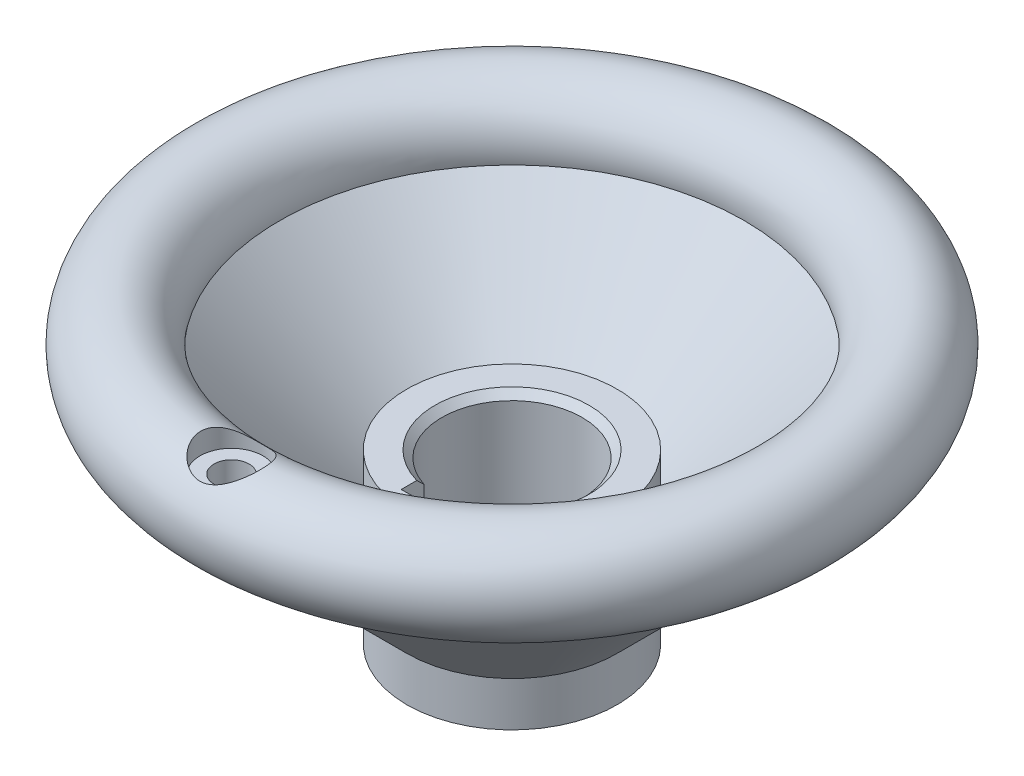
ISO-10303-21;
HEADER;
FILE_DESCRIPTION(('STEP AP214'),'2;1');
FILE_NAME('part.step','',(''),(''),'','','');
FILE_SCHEMA(('AUTOMOTIVE_DESIGN { 1 0 10303 214 1 1 1 1 }'));
ENDSEC;
DATA;
#1=APPLICATION_CONTEXT('core data for automotive mechanical design processes');
#2=APPLICATION_PROTOCOL_DEFINITION('international standard','automotive_design',2000,#1);
#3=PRODUCT_CONTEXT('',#1,'mechanical');
#4=PRODUCT('Part','Part','',(#3));
#5=PRODUCT_RELATED_PRODUCT_CATEGORY('part','',(#4));
#6=PRODUCT_DEFINITION_FORMATION('','',#4);
#7=PRODUCT_DEFINITION_CONTEXT('part definition',#1,'design');
#8=PRODUCT_DEFINITION('design','',#6,#7);
#9=PRODUCT_DEFINITION_SHAPE('','',#8);
#10=(LENGTH_UNIT() NAMED_UNIT(*) SI_UNIT(.MILLI.,.METRE.));
#11=(NAMED_UNIT(*) PLANE_ANGLE_UNIT() SI_UNIT($,.RADIAN.));
#12=(NAMED_UNIT(*) SI_UNIT($,.STERADIAN.) SOLID_ANGLE_UNIT());
#13=UNCERTAINTY_MEASURE_WITH_UNIT(LENGTH_MEASURE(1.E-05),#10,'distance_accuracy_value','');
#14=(GEOMETRIC_REPRESENTATION_CONTEXT(3) GLOBAL_UNCERTAINTY_ASSIGNED_CONTEXT((#13)) GLOBAL_UNIT_ASSIGNED_CONTEXT((#10,
#11,#12)) REPRESENTATION_CONTEXT('',''));
#15=CARTESIAN_POINT('',(0.,0.,0.));
#16=DIRECTION('',(0.,0.,1.));
#17=DIRECTION('',(1.,0.,0.));
#18=AXIS2_PLACEMENT_3D('',#15,#16,#17);
#19=CARTESIAN_POINT('',(0.,12.,0.));
#20=DIRECTION('',(0.,-1.,0.));
#21=DIRECTION('',(0.,0.,-1.));
#22=AXIS2_PLACEMENT_3D('',#19,#20,#21);
#23=CYLINDRICAL_SURFACE('',#22,7.5);
#24=CARTESIAN_POINT('',(0.,8.82842712474618,0.));
#25=DIRECTION('',(0.,1.,0.));
#26=DIRECTION('',(0.,0.,1.));
#27=AXIS2_PLACEMENT_3D('',#24,#25,#26);
#28=CIRCLE('',#27,7.5);
#29=CARTESIAN_POINT('',(0.,8.82842712474618,7.5));
#30=VERTEX_POINT('',#29);
#31=EDGE_CURVE('E165',#30,#30,#28,.T.);
#32=ORIENTED_EDGE('',*,*,#31,.T.);
#33=EDGE_LOOP('',(#32));
#34=FACE_BOUND('',#33,.T.);
#35=CARTESIAN_POINT('',(0.,12.,0.));
#36=DIRECTION('',(0.,1.,0.));
#37=DIRECTION('',(0.,0.,1.));
#38=AXIS2_PLACEMENT_3D('',#35,#36,#37);
#39=CIRCLE('',#38,7.5);
#40=CARTESIAN_POINT('',(0.,12.,7.5));
#41=VERTEX_POINT('',#40);
#42=EDGE_CURVE('E158',#41,#41,#39,.T.);
#43=ORIENTED_EDGE('',*,*,#42,.F.);
#44=EDGE_LOOP('',(#43));
#45=FACE_BOUND('',#44,.T.);
#46=ADVANCED_FACE('F45',(#34,#45),#23,.T.);
#47=CARTESIAN_POINT('',(0.,12.,0.));
#48=DIRECTION('',(0.,1.,0.));
#49=DIRECTION('',(0.,0.,1.));
#50=AXIS2_PLACEMENT_3D('',#47,#48,#49);
#51=PLANE('',#50);
#52=DIRECTION('',(0.,0.,1.));
#53=VECTOR('',#52,1.);
#54=CARTESIAN_POINT('',(-1.5,12.,4.76969600708473));
#55=LINE('',#54,#53);
#56=CARTESIAN_POINT('',(-1.5,12.,5.29150262212919));
#57=VERTEX_POINT('',#56);
#58=CARTESIAN_POINT('',(-1.5,12.,6.4));
#59=VERTEX_POINT('',#58);
#60=EDGE_CURVE('E138',#57,#59,#55,.T.);
#61=ORIENTED_EDGE('',*,*,#60,.F.);
#62=CARTESIAN_POINT('',(0.,12.,0.));
#63=DIRECTION('',(0.,1.,0.));
#64=DIRECTION('',(0.,0.,1.));
#65=AXIS2_PLACEMENT_3D('',#62,#63,#64);
#66=CIRCLE('',#65,5.50000000000001);
#67=CARTESIAN_POINT('',(1.5,12.,5.29150262212919));
#68=VERTEX_POINT('',#67);
#69=EDGE_CURVE('E60',#57,#68,#66,.F.);
#70=ORIENTED_EDGE('',*,*,#69,.T.);
#71=DIRECTION('',(0.,0.,-1.));
#72=VECTOR('',#71,1.);
#73=CARTESIAN_POINT('',(1.5,12.,4.76969600708473));
#74=LINE('',#73,#72);
#75=CARTESIAN_POINT('',(1.5,12.,6.4));
#76=VERTEX_POINT('',#75);
#77=EDGE_CURVE('E122',#76,#68,#74,.T.);
#78=ORIENTED_EDGE('',*,*,#77,.F.);
#79=DIRECTION('',(1.,0.,0.));
#80=VECTOR('',#79,1.);
#81=CARTESIAN_POINT('',(-1.5,12.,6.4));
#82=LINE('',#81,#80);
#83=EDGE_CURVE('E131',#59,#76,#82,.T.);
#84=ORIENTED_EDGE('',*,*,#83,.F.);
#85=EDGE_LOOP('',(#61,#70,#78,#84));
#86=FACE_BOUND('',#85,.T.);
#87=ORIENTED_EDGE('',*,*,#42,.T.);
#88=EDGE_LOOP('',(#87));
#89=FACE_BOUND('',#88,.T.);
#90=ADVANCED_FACE('F234',(#86,#89),#51,.T.);
#91=CARTESIAN_POINT('',(0.,17.8832039612141,0.));
#92=DIRECTION('',(0.,1.,0.));
#93=DIRECTION('',(0.,0.,1.));
#94=AXIS2_PLACEMENT_3D('',#91,#92,#93);
#95=CONICAL_SURFACE('',#94,16.5547768364679,0.78539816339745);
#96=CARTESIAN_POINT('',(0.,17.8832039612141,0.));
#97=DIRECTION('',(0.,-1.,0.));
#98=DIRECTION('',(0.,0.,-1.));
#99=AXIS2_PLACEMENT_3D('',#96,#97,#98);
#100=CIRCLE('',#99,16.5547768364679);
#101=CARTESIAN_POINT('',(0.,17.8832039612141,-16.5547768364679));
#102=VERTEX_POINT('',#101);
#103=EDGE_CURVE('E144',#102,#102,#100,.T.);
#104=ORIENTED_EDGE('',*,*,#103,.F.);
#105=EDGE_LOOP('',(#104));
#106=FACE_BOUND('',#105,.T.);
#107=ORIENTED_EDGE('',*,*,#31,.F.);
#108=EDGE_LOOP('',(#107));
#109=FACE_BOUND('',#108,.T.);
#110=ADVANCED_FACE('F237',(#106,#109),#95,.F.);
#111=CARTESIAN_POINT('',(0.,1.48222981154403,0.));
#112=DIRECTION('',(0.,1.,0.));
#113=DIRECTION('',(0.,0.,1.));
#114=AXIS2_PLACEMENT_3D('',#111,#112,#113);
#115=CONICAL_SURFACE('',#114,5.8106569362902,0.78539816339745);
#116=CARTESIAN_POINT('',(0.,15.0547768364679,0.));
#117=DIRECTION('',(0.,-1.,0.));
#118=DIRECTION('',(0.,0.,-1.));
#119=AXIS2_PLACEMENT_3D('',#116,#117,#118);
#120=CIRCLE('',#119,19.3832039612141);
#121=CARTESIAN_POINT('',(0.,15.0547768364679,-19.3832039612141));
#122=VERTEX_POINT('',#121);
#123=EDGE_CURVE('E154',#122,#122,#120,.T.);
#124=ORIENTED_EDGE('',*,*,#123,.T.);
#125=EDGE_LOOP('',(#124));
#126=FACE_BOUND('',#125,.T.);
#127=CARTESIAN_POINT('',(0.,3.17157287525382,0.));
#128=DIRECTION('',(0.,1.,0.));
#129=DIRECTION('',(0.,0.,1.));
#130=AXIS2_PLACEMENT_3D('',#127,#128,#129);
#131=CIRCLE('',#130,7.5);
#132=CARTESIAN_POINT('',(0.,3.17157287525382,7.5));
#133=VERTEX_POINT('',#132);
#134=EDGE_CURVE('E157',#133,#133,#131,.F.);
#135=ORIENTED_EDGE('',*,*,#134,.F.);
#136=EDGE_LOOP('',(#135));
#137=FACE_BOUND('',#136,.T.);
#138=ADVANCED_FACE('F239',(#126,#137),#115,.T.);
#139=CARTESIAN_POINT('',(0.,18.5,0.));
#140=DIRECTION('',(0.,-1.,0.));
#141=DIRECTION('',(0.,0.,-1.));
#142=AXIS2_PLACEMENT_3D('',#139,#140,#141);
#143=TOROIDAL_SURFACE('',#142,20.,3.5);
#144=CARTESIAN_POINT('',(-1.47727880663159,21.5932726998178,18.3029001784097));
#145=CARTESIAN_POINT('',(-1.56845154597499,21.6390304022939,18.3822629408683));
#146=CARTESIAN_POINT('',(-1.65352183473045,21.6841788882098,18.4692135636341));
#147=CARTESIAN_POINT('',(-1.80972216992081,21.7690618744177,18.6574711062604));
#148=CARTESIAN_POINT('',(-1.88082773189558,21.8087868290786,18.7588027140786));
#149=CARTESIAN_POINT('',(-2.00691726987954,21.8792612896217,18.9750465448799));
#150=CARTESIAN_POINT('',(-2.06178688938913,21.9099471227139,19.090047458935));
#151=CARTESIAN_POINT('',(-2.15171910909734,21.9587128231451,19.329962861992));
#152=CARTESIAN_POINT('',(-2.18681434127679,21.9768134703613,19.4548606281699));
#153=CARTESIAN_POINT('',(-2.23208932601888,21.9972687877927,19.6945318712509));
#154=CARTESIAN_POINT('',(-2.24477438016194,22.0012667260555,19.8086964131547));
#155=CARTESIAN_POINT('',(-2.25259527180785,21.9980308488224,20.0374653126205));
#156=CARTESIAN_POINT('',(-2.24773206569072,21.9907976454358,20.152069645874));
#157=CARTESIAN_POINT('',(-2.22179483108512,21.9668818061096,20.3707878981555));
#158=CARTESIAN_POINT('',(-2.2017818755647,21.9508358175078,20.4751028702129));
#159=CARTESIAN_POINT('',(-2.14782942395006,21.9112119258892,20.6785355244605));
#160=CARTESIAN_POINT('',(-2.11388743120762,21.8876326727738,20.7776522713241));
#161=CARTESIAN_POINT('',(-2.03000444260301,21.8324843969691,20.9768376055811));
#162=CARTESIAN_POINT('',(-1.97897100873849,21.8004153110861,21.0763048487231));
#163=CARTESIAN_POINT('',(-1.86365243585774,21.7318496710315,21.2655416618503));
#164=CARTESIAN_POINT('',(-1.79936055233844,21.6953508673895,21.3553062605909));
#165=CARTESIAN_POINT('',(-1.64886554849092,21.6150199577397,21.5360568928384));
#166=CARTESIAN_POINT('',(-1.56084651831428,21.5708832338317,21.6254003725458));
#167=CARTESIAN_POINT('',(-1.37075752123344,21.4838213225061,21.7886438275161));
#168=CARTESIAN_POINT('',(-1.26866933921445,21.4408977940495,21.8625234644781));
#169=CARTESIAN_POINT('',(-1.04485635059562,21.3580630803932,21.9972258494305));
#170=CARTESIAN_POINT('',(-0.922289660554157,21.3185248082538,22.0568989532558));
#171=CARTESIAN_POINT('',(-0.665485480758573,21.2519503416598,22.1536794633896));
#172=CARTESIAN_POINT('',(-0.531278413412937,21.2248826591948,22.1908437795362));
#173=CARTESIAN_POINT('',(-0.276039555177967,21.1914264392034,22.2361930463865));
#174=CARTESIAN_POINT('',(-0.155949146408666,21.1825936538152,22.2478197234411));
#175=CARTESIAN_POINT('',(0.0846922601254755,21.1797345806001,22.2516160735403));
#176=CARTESIAN_POINT('',(0.205242930149422,21.1856992130502,22.2437976781101));
#177=CARTESIAN_POINT('',(0.424118861056313,21.2093096392115,22.2120090071392));
#178=CARTESIAN_POINT('',(0.523055586396096,21.2250594885355,22.1906505630549));
#179=CARTESIAN_POINT('',(0.715732568615188,21.2644352688114,22.1354797990461));
#180=CARTESIAN_POINT('',(0.809470694826046,21.2880644017019,22.1016624155416));
#181=CARTESIAN_POINT('',(0.999349356898884,21.3435385255845,22.0188070031763));
#182=CARTESIAN_POINT('',(1.09479953143525,21.3759673560684,21.9685886053456));
#183=CARTESIAN_POINT('',(1.2766321060746,21.4446144441391,21.8558475628448));
#184=CARTESIAN_POINT('',(1.36300892045286,21.4808350089119,21.7933174061229));
#185=CARTESIAN_POINT('',(1.54137514178523,21.5614385721164,21.6439724830335));
#186=CARTESIAN_POINT('',(1.63129552331916,21.6060613194435,21.5548006741058));
#187=CARTESIAN_POINT('',(1.79547970127059,21.6929333535343,21.3619117846096));
#188=CARTESIAN_POINT('',(1.86973213297295,21.7351809012691,21.2581842362486));
#189=CARTESIAN_POINT('',(2.00353709397674,21.8153865190314,21.0326279920797));
#190=CARTESIAN_POINT('',(2.06222898383506,21.8530474781152,20.9101754822533));
#191=CARTESIAN_POINT('',(2.15710928897952,21.9173928847371,20.6541725302564));
#192=CARTESIAN_POINT('',(2.19332807047042,21.9440921274234,20.520637341278));
#193=CARTESIAN_POINT('',(2.2377287420905,21.9804950624323,20.2642411916041));
#194=CARTESIAN_POINT('',(2.24885122692283,21.9919070568031,20.14213471665));
#195=CARTESIAN_POINT('',(2.2509764320579,22.0020230693047,19.8972492599268));
#196=CARTESIAN_POINT('',(2.24199595671237,22.0007376982791,19.7744709253643));
#197=CARTESIAN_POINT('',(2.20661028672077,21.9862124671216,19.5472190218288));
#198=CARTESIAN_POINT('',(2.18239610708235,21.9744073134134,19.4423004661948));
#199=CARTESIAN_POINT('',(2.1198339502272,21.9416393182886,19.2382994675422));
#200=CARTESIAN_POINT('',(2.08148478456214,21.9206757068153,19.1392175160692));
#201=CARTESIAN_POINT('',(1.99109350703087,21.8704939689413,18.9465949966483));
#202=CARTESIAN_POINT('',(1.93872924543409,21.841080259635,18.853258285233));
#203=CARTESIAN_POINT('',(1.82251512244681,21.7763609581868,18.6763083884889));
#204=CARTESIAN_POINT('',(1.75865932356798,21.7410523209173,18.5927002667077));
#205=CARTESIAN_POINT('',(1.61065125684217,21.6614227315802,18.4243499600132));
#206=CARTESIAN_POINT('',(1.52489292642156,21.6165423106812,18.3412867195315));
#207=CARTESIAN_POINT('',(1.34150586527712,21.5261483139317,18.1897425407677));
#208=CARTESIAN_POINT('',(1.24386670770645,21.480634213424,18.1212745586907));
#209=CARTESIAN_POINT('',(1.04488989864754,21.3968122387148,18.0042365294446));
#210=CARTESIAN_POINT('',(0.944300203822473,21.3582224558322,17.9546028551857));
#211=CARTESIAN_POINT('',(0.734431701661402,21.2893301670725,17.8702493169584));
#212=CARTESIAN_POINT('',(0.625170310403385,21.2590115672819,17.8355004142276));
#213=CARTESIAN_POINT('',(0.421641463016024,21.2163572770021,17.7878924890708));
#214=CARTESIAN_POINT('',(0.328565798708353,21.2016766036394,17.7720981946783));
#215=CARTESIAN_POINT('',(0.14014672693002,21.1832429136199,17.752378525416));
#216=CARTESIAN_POINT('',(0.0448064035140433,21.1794758083087,17.7484378481019));
#217=CARTESIAN_POINT('',(-0.145363640750595,21.1834891498413,17.7526858206165));
#218=CARTESIAN_POINT('',(-0.240193247950336,21.1912720683222,17.7608770666042));
#219=CARTESIAN_POINT('',(-0.426787252833382,21.2171019031254,17.7888266382236));
#220=CARTESIAN_POINT('',(-0.518545377716807,21.235168611052,17.8086072702952));
#221=CARTESIAN_POINT('',(-0.72461303897506,21.2858346954446,17.8664213257353));
#222=CARTESIAN_POINT('',(-0.837175102285223,21.3211951250353,17.9081981282193));
#223=CARTESIAN_POINT('',(-1.0521174044516,21.3991701727898,18.0076160516821));
#224=CARTESIAN_POINT('',(-1.1544998288884,21.441783228455,18.06525375725));
#225=CARTESIAN_POINT('',(-1.29089895129623,21.5032616943353,18.1565434894528));
#226=CARTESIAN_POINT('',(-1.32947869341562,21.5212371671082,18.1841715660223));
#227=CARTESIAN_POINT('',(-1.4047780658201,21.5572639559151,18.2417775146131));
#228=CARTESIAN_POINT('',(-1.44149836882091,21.5753152419241,18.2717545266822));
#229=CARTESIAN_POINT('',(-1.47727880663159,21.5932726998178,18.3029001784097));
#230=B_SPLINE_CURVE_WITH_KNOTS('',3,(#144,#145,#146,#147,#148,#149,#150,#151,#152,#153,#154,
#155,#156,#157,#158,#159,#160,#161,#162,#163,#164,#165,#166,#167,#168,#169,#170,#171,#172,#173,
#174,#175,#176,#177,#178,#179,#180,#181,#182,#183,#184,#185,#186,#187,#188,#189,#190,#191,#192,
#193,#194,#195,#196,#197,#198,#199,#200,#201,#202,#203,#204,#205,#206,#207,#208,#209,#210,#211,
#212,#213,#214,#215,#216,#217,#218,#219,#220,#221,#222,#223,#224,#225,#226,#227,#228,#229),
.UNSPECIFIED.,.T.,.F.,(4,2,2,2,2,2,2,2,2,2,2,2,2,2,2,2,2,2,2,2,2,2,2,2,2,2,2,2,2,2,2,2,2,2,2,2,
2,2,2,2,2,2,4),(0.,0.387576192773628,0.775825975326136,1.16674860215185,1.5570242191012,
1.89997286444248,2.24290281936827,2.56381068685209,2.88477609917731,3.232330482434,
3.58006210281864,3.97725726816522,4.37497159342683,4.79834055392325,5.22063457652127,
5.58120530918695,5.94155484971127,6.24759614119441,6.55376195187329,6.89041706176303,
7.22727822277779,7.62835569610782,8.02972309764166,8.45006057670656,8.86982884167894,
9.23708401072946,9.60403230058384,9.92749572255798,10.2509863470552,10.5826685821008,
10.9145226865235,11.2957075902749,11.6772294754469,12.0318121129619,12.3856998078525,
12.6710826740843,12.9560969664369,13.2411722589625,13.5267980554187,13.9003020515864,
14.2737256820482,14.425884115366,14.5779871009987),.UNSPECIFIED.);
#231=CARTESIAN_POINT('',(-1.47727880663159,21.5932726998178,18.3029001784097));
#232=VERTEX_POINT('',#231);
#233=EDGE_CURVE('E11',#232,#232,#230,.T.);
#234=ORIENTED_EDGE('',*,*,#233,.F.);
#235=EDGE_LOOP('',(#234));
#236=FACE_BOUND('',#235,.T.);
#237=ORIENTED_EDGE('',*,*,#103,.T.);
#238=EDGE_LOOP('',(#237));
#239=FACE_BOUND('',#238,.T.);
#240=ORIENTED_EDGE('',*,*,#123,.F.);
#241=EDGE_LOOP('',(#240));
#242=FACE_BOUND('',#241,.T.);
#243=ADVANCED_FACE('F203',(#236,#239,#242),#143,.T.);
#244=CARTESIAN_POINT('',(0.,0.,0.));
#245=DIRECTION('',(0.,1.,0.));
#246=DIRECTION('',(0.,0.,1.));
#247=AXIS2_PLACEMENT_3D('',#244,#245,#246);
#248=PLANE('',#247);
#249=DIRECTION('',(0.,0.,-1.));
#250=VECTOR('',#249,1.);
#251=CARTESIAN_POINT('',(1.5,0.,4.76969600708473));
#252=LINE('',#251,#250);
#253=CARTESIAN_POINT('',(1.5,0.,6.4));
#254=VERTEX_POINT('',#253);
#255=CARTESIAN_POINT('',(1.5,0.,5.29150262212918));
#256=VERTEX_POINT('',#255);
#257=EDGE_CURVE('E127',#254,#256,#252,.T.);
#258=ORIENTED_EDGE('',*,*,#257,.T.);
#259=CARTESIAN_POINT('',(0.,0.,0.));
#260=DIRECTION('',(0.,1.,0.));
#261=DIRECTION('',(0.,0.,1.));
#262=AXIS2_PLACEMENT_3D('',#259,#260,#261);
#263=CIRCLE('',#262,5.5);
#264=CARTESIAN_POINT('',(-1.5,0.,5.29150262212918));
#265=VERTEX_POINT('',#264);
#266=EDGE_CURVE('E161',#256,#265,#263,.T.);
#267=ORIENTED_EDGE('',*,*,#266,.T.);
#268=DIRECTION('',(0.,0.,1.));
#269=VECTOR('',#268,1.);
#270=CARTESIAN_POINT('',(-1.5,0.,4.76969600708473));
#271=LINE('',#270,#269);
#272=CARTESIAN_POINT('',(-1.5,0.,6.4));
#273=VERTEX_POINT('',#272);
#274=EDGE_CURVE('E130',#265,#273,#271,.T.);
#275=ORIENTED_EDGE('',*,*,#274,.T.);
#276=DIRECTION('',(1.,0.,0.));
#277=VECTOR('',#276,1.);
#278=CARTESIAN_POINT('',(-1.5,0.,6.4));
#279=LINE('',#278,#277);
#280=EDGE_CURVE('E133',#273,#254,#279,.T.);
#281=ORIENTED_EDGE('',*,*,#280,.T.);
#282=EDGE_LOOP('',(#258,#267,#275,#281));
#283=FACE_BOUND('',#282,.T.);
#284=CARTESIAN_POINT('',(0.,0.,0.));
#285=DIRECTION('',(0.,1.,0.));
#286=DIRECTION('',(0.,0.,1.));
#287=AXIS2_PLACEMENT_3D('',#284,#285,#286);
#288=CIRCLE('',#287,7.5);
#289=CARTESIAN_POINT('',(0.,0.,7.5));
#290=VERTEX_POINT('',#289);
#291=EDGE_CURVE('E162',#290,#290,#288,.T.);
#292=ORIENTED_EDGE('',*,*,#291,.F.);
#293=EDGE_LOOP('',(#292));
#294=FACE_BOUND('',#293,.T.);
#295=ADVANCED_FACE('F229',(#283,#294),#248,.F.);
#296=ORIENTED_EDGE('',*,*,#134,.T.);
#297=EDGE_LOOP('',(#296));
#298=FACE_BOUND('',#297,.T.);
#299=ORIENTED_EDGE('',*,*,#291,.T.);
#300=EDGE_LOOP('',(#299));
#301=FACE_BOUND('',#300,.T.);
#302=ADVANCED_FACE('F202',(#298,#301),#23,.T.);
#303=CARTESIAN_POINT('',(1.5,0.,4.76969600708473));
#304=DIRECTION('',(1.,0.,0.));
#305=DIRECTION('',(0.,0.,-1.));
#306=AXIS2_PLACEMENT_3D('',#303,#304,#305);
#307=PLANE('',#306);
#308=DIRECTION('',(0.,1.,0.));
#309=VECTOR('',#308,1.);
#310=CARTESIAN_POINT('',(1.5,0.,4.76969600708473));
#311=LINE('',#310,#309);
#312=CARTESIAN_POINT('',(1.5,0.5,4.76969600708473));
#313=VERTEX_POINT('',#312);
#314=CARTESIAN_POINT('',(1.5,11.5,4.76969600708473));
#315=VERTEX_POINT('',#314);
#316=EDGE_CURVE('E136',#313,#315,#311,.T.);
#317=ORIENTED_EDGE('',*,*,#316,.F.);
#318=CARTESIAN_POINT('',(1.5,0.5,4.76969600708473));
#319=CARTESIAN_POINT('',(1.5,0.416851049656514,4.85684046269966));
#320=CARTESIAN_POINT('',(1.5,0.333609905583201,4.94389657741666));
#321=CARTESIAN_POINT('',(1.5,0.166943238896798,5.1178321157459));
#322=CARTESIAN_POINT('',(1.5,0.0835177163034442,5.20471153937705));
#323=CARTESIAN_POINT('',(1.5,0.,5.29150262212918));
#324=B_SPLINE_CURVE_WITH_KNOTS('',3,(#318,#319,#320,#321,#322,#323),.UNSPECIFIED.,.F.,.F.,(4,2,
4),(0.,0.361345674647257,0.722691310616609),.UNSPECIFIED.);
#325=EDGE_CURVE('E214',#313,#256,#324,.T.);
#326=ORIENTED_EDGE('',*,*,#325,.T.);
#327=ORIENTED_EDGE('',*,*,#257,.F.);
#328=DIRECTION('',(0.,1.,0.));
#329=VECTOR('',#328,1.);
#330=CARTESIAN_POINT('',(1.5,0.,6.4));
#331=LINE('',#330,#329);
#332=EDGE_CURVE('E142',#254,#76,#331,.T.);
#333=ORIENTED_EDGE('',*,*,#332,.T.);
#334=ORIENTED_EDGE('',*,*,#77,.T.);
#335=CARTESIAN_POINT('',(1.5,12.,5.29150262212919));
#336=CARTESIAN_POINT('',(1.5,11.9164822836966,5.20471153937706));
#337=CARTESIAN_POINT('',(1.5,11.8330567611032,5.11783211574591));
#338=CARTESIAN_POINT('',(1.5,11.6663900944168,4.94389657741666));
#339=CARTESIAN_POINT('',(1.5,11.5831489503435,4.85684046269966));
#340=CARTESIAN_POINT('',(1.5,11.5,4.76969600708473));
#341=B_SPLINE_CURVE_WITH_KNOTS('',3,(#335,#336,#337,#338,#339,#340),.UNSPECIFIED.,.F.,.F.,(4,2,
4),(0.,0.361345635969359,0.722691310616624),.UNSPECIFIED.);
#342=EDGE_CURVE('E73',#68,#315,#341,.T.);
#343=ORIENTED_EDGE('',*,*,#342,.T.);
#344=EDGE_LOOP('',(#317,#326,#327,#333,#334,#343));
#345=FACE_BOUND('',#344,.T.);
#346=ADVANCED_FACE('F199',(#345),#307,.F.);
#347=CARTESIAN_POINT('',(-1.5,0.,6.4));
#348=DIRECTION('',(0.,0.,1.));
#349=DIRECTION('',(1.,0.,0.));
#350=AXIS2_PLACEMENT_3D('',#347,#348,#349);
#351=PLANE('',#350);
#352=ORIENTED_EDGE('',*,*,#83,.T.);
#353=ORIENTED_EDGE('',*,*,#332,.F.);
#354=ORIENTED_EDGE('',*,*,#280,.F.);
#355=DIRECTION('',(0.,1.,0.));
#356=VECTOR('',#355,1.);
#357=CARTESIAN_POINT('',(-1.5,0.,6.4));
#358=LINE('',#357,#356);
#359=EDGE_CURVE('E145',#273,#59,#358,.T.);
#360=ORIENTED_EDGE('',*,*,#359,.T.);
#361=EDGE_LOOP('',(#352,#353,#354,#360));
#362=FACE_BOUND('',#361,.T.);
#363=ADVANCED_FACE('F191',(#362),#351,.F.);
#364=CARTESIAN_POINT('',(-1.5,0.,4.76969600708473));
#365=DIRECTION('',(-1.,0.,0.));
#366=DIRECTION('',(0.,0.,1.));
#367=AXIS2_PLACEMENT_3D('',#364,#365,#366);
#368=PLANE('',#367);
#369=ORIENTED_EDGE('',*,*,#274,.F.);
#370=CARTESIAN_POINT('',(-1.5,0.,5.29150262212918));
#371=CARTESIAN_POINT('',(-1.5,0.0835177163034442,5.20471153937705));
#372=CARTESIAN_POINT('',(-1.5,0.166943238896798,5.1178321157459));
#373=CARTESIAN_POINT('',(-1.5,0.333609905583201,4.94389657741666));
#374=CARTESIAN_POINT('',(-1.5,0.416851049656514,4.85684046269966));
#375=CARTESIAN_POINT('',(-1.5,0.500000000000001,4.76969600708473));
#376=B_SPLINE_CURVE_WITH_KNOTS('',3,(#370,#371,#372,#373,#374,#375),.UNSPECIFIED.,.F.,.F.,(4,2,
4),(0.,0.361345635969352,0.722691310616609),.UNSPECIFIED.);
#377=CARTESIAN_POINT('',(-1.5,0.5,4.76969600708473));
#378=VERTEX_POINT('',#377);
#379=EDGE_CURVE('E179',#265,#378,#376,.T.);
#380=ORIENTED_EDGE('',*,*,#379,.T.);
#381=DIRECTION('',(0.,1.,0.));
#382=VECTOR('',#381,1.);
#383=CARTESIAN_POINT('',(-1.5,0.,4.76969600708473));
#384=LINE('',#383,#382);
#385=CARTESIAN_POINT('',(-1.5,11.5,4.76969600708473));
#386=VERTEX_POINT('',#385);
#387=EDGE_CURVE('E148',#378,#386,#384,.T.);
#388=ORIENTED_EDGE('',*,*,#387,.T.);
#389=CARTESIAN_POINT('',(-1.5,11.5,4.76969600708473));
#390=CARTESIAN_POINT('',(-1.5,11.5831489503435,4.85684046269966));
#391=CARTESIAN_POINT('',(-1.5,11.6663900944168,4.94389657741666));
#392=CARTESIAN_POINT('',(-1.5,11.8330567611032,5.11783211574591));
#393=CARTESIAN_POINT('',(-1.5,11.9164822836966,5.20471153937706));
#394=CARTESIAN_POINT('',(-1.5,12.,5.29150262212919));
#395=B_SPLINE_CURVE_WITH_KNOTS('',3,(#389,#390,#391,#392,#393,#394),.UNSPECIFIED.,.F.,.F.,(4,2,
4),(0.,0.361345674647265,0.722691310616624),.UNSPECIFIED.);
#396=EDGE_CURVE('E172',#386,#57,#395,.T.);
#397=ORIENTED_EDGE('',*,*,#396,.T.);
#398=ORIENTED_EDGE('',*,*,#60,.T.);
#399=ORIENTED_EDGE('',*,*,#359,.F.);
#400=EDGE_LOOP('',(#369,#380,#388,#397,#398,#399));
#401=FACE_BOUND('',#400,.T.);
#402=ADVANCED_FACE('F185',(#401),#368,.F.);
#403=CARTESIAN_POINT('',(0.,0.,0.));
#404=DIRECTION('',(0.,1.,0.));
#405=DIRECTION('',(0.,0.,1.));
#406=AXIS2_PLACEMENT_3D('',#403,#404,#405);
#407=CYLINDRICAL_SURFACE('',#406,5.);
#408=ORIENTED_EDGE('',*,*,#387,.F.);
#409=CARTESIAN_POINT('',(0.,0.5,0.));
#410=DIRECTION('',(0.,1.,0.));
#411=DIRECTION('',(0.,0.,1.));
#412=AXIS2_PLACEMENT_3D('',#409,#410,#411);
#413=CIRCLE('',#412,5.);
#414=EDGE_CURVE('E372',#378,#313,#413,.F.);
#415=ORIENTED_EDGE('',*,*,#414,.T.);
#416=ORIENTED_EDGE('',*,*,#316,.T.);
#417=CARTESIAN_POINT('',(0.,11.5,0.));
#418=DIRECTION('',(0.,1.,0.));
#419=DIRECTION('',(0.,0.,1.));
#420=AXIS2_PLACEMENT_3D('',#417,#418,#419);
#421=CIRCLE('',#420,5.);
#422=EDGE_CURVE('E371',#315,#386,#421,.T.);
#423=ORIENTED_EDGE('',*,*,#422,.T.);
#424=EDGE_LOOP('',(#408,#415,#416,#423));
#425=FACE_BOUND('',#424,.T.);
#426=ADVANCED_FACE('F190',(#425),#407,.F.);
#427=CARTESIAN_POINT('',(0.,0.,0.));
#428=DIRECTION('',(0.,-1.,0.));
#429=DIRECTION('',(0.,0.,-1.));
#430=AXIS2_PLACEMENT_3D('',#427,#428,#429);
#431=CONICAL_SURFACE('',#430,5.5,0.785398163397445);
#432=ORIENTED_EDGE('',*,*,#325,.F.);
#433=ORIENTED_EDGE('',*,*,#414,.F.);
#434=ORIENTED_EDGE('',*,*,#379,.F.);
#435=ORIENTED_EDGE('',*,*,#266,.F.);
#436=EDGE_LOOP('',(#432,#433,#434,#435));
#437=FACE_BOUND('',#436,.T.);
#438=ADVANCED_FACE('F197',(#437),#431,.F.);
#439=CARTESIAN_POINT('',(0.,11.5,0.));
#440=DIRECTION('',(0.,1.,0.));
#441=DIRECTION('',(0.,0.,1.));
#442=AXIS2_PLACEMENT_3D('',#439,#440,#441);
#443=CONICAL_SURFACE('',#442,5.,0.785398163397452);
#444=ORIENTED_EDGE('',*,*,#342,.F.);
#445=ORIENTED_EDGE('',*,*,#69,.F.);
#446=ORIENTED_EDGE('',*,*,#396,.F.);
#447=ORIENTED_EDGE('',*,*,#422,.F.);
#448=EDGE_LOOP('',(#444,#445,#446,#447));
#449=FACE_BOUND('',#448,.T.);
#450=ADVANCED_FACE('F48',(#449),#443,.F.);
#451=CARTESIAN_POINT('',(0.,20.5,20.));
#452=DIRECTION('',(0.,-1.,0.));
#453=DIRECTION('',(0.,0.,-1.));
#454=AXIS2_PLACEMENT_3D('',#451,#452,#453);
#455=PLANE('',#454);
#456=CARTESIAN_POINT('',(0.,20.5,20.));
#457=DIRECTION('',(0.,1.,0.));
#458=DIRECTION('',(0.,0.,1.));
#459=AXIS2_PLACEMENT_3D('',#456,#457,#458);
#460=CIRCLE('',#459,1.24999999999999);
#461=CARTESIAN_POINT('',(0.,20.5,21.25));
#462=VERTEX_POINT('',#461);
#463=EDGE_CURVE('E119',#462,#462,#460,.T.);
#464=ORIENTED_EDGE('',*,*,#463,.F.);
#465=EDGE_LOOP('',(#464));
#466=FACE_BOUND('',#465,.T.);
#467=CARTESIAN_POINT('',(0.,20.5,20.));
#468=DIRECTION('',(0.,1.,0.));
#469=DIRECTION('',(0.,0.,1.));
#470=AXIS2_PLACEMENT_3D('',#467,#468,#469);
#471=CIRCLE('',#470,2.25000000000001);
#472=CARTESIAN_POINT('',(0.,20.5,22.25));
#473=VERTEX_POINT('',#472);
#474=EDGE_CURVE('E118',#473,#473,#471,.T.);
#475=ORIENTED_EDGE('',*,*,#474,.T.);
#476=EDGE_LOOP('',(#475));
#477=FACE_BOUND('',#476,.T.);
#478=ADVANCED_FACE('F318',(#466,#477),#455,.F.);
#479=CARTESIAN_POINT('',(0.,22.,20.));
#480=DIRECTION('',(0.,1.,0.));
#481=DIRECTION('',(0.,0.,1.));
#482=AXIS2_PLACEMENT_3D('',#479,#480,#481);
#483=CYLINDRICAL_SURFACE('',#482,2.25000000000001);
#484=ORIENTED_EDGE('',*,*,#233,.T.);
#485=EDGE_LOOP('',(#484));
#486=FACE_BOUND('',#485,.T.);
#487=ORIENTED_EDGE('',*,*,#474,.F.);
#488=EDGE_LOOP('',(#487));
#489=FACE_BOUND('',#488,.T.);
#490=ADVANCED_FACE('F112',(#486,#489),#483,.F.);
#491=CARTESIAN_POINT('',(0.,17.2510757737844,20.));
#492=DIRECTION('',(0.,1.,0.));
#493=DIRECTION('',(0.,0.,1.));
#494=AXIS2_PLACEMENT_3D('',#491,#492,#493);
#495=CONICAL_SURFACE('',#494,1.25,1.02974425867665);
#496=CARTESIAN_POINT('',(0.,16.5,20.));
#497=VERTEX_POINT('',#496);
#498=VERTEX_LOOP('',#497);
#499=FACE_BOUND('',#498,.T.);
#500=CARTESIAN_POINT('',(0.,17.2510757737844,20.));
#501=DIRECTION('',(0.,1.,0.));
#502=DIRECTION('',(0.,0.,1.));
#503=AXIS2_PLACEMENT_3D('',#500,#501,#502);
#504=CIRCLE('',#503,1.25);
#505=CARTESIAN_POINT('',(0.,17.2510757737844,21.25));
#506=VERTEX_POINT('',#505);
#507=EDGE_CURVE('E116',#506,#506,#504,.T.);
#508=ORIENTED_EDGE('',*,*,#507,.T.);
#509=EDGE_LOOP('',(#508));
#510=FACE_BOUND('',#509,.T.);
#511=ADVANCED_FACE('F108',(#499,#510),#495,.F.);
#512=CARTESIAN_POINT('',(0.,20.5,20.));
#513=DIRECTION('',(0.,1.,0.));
#514=DIRECTION('',(0.,0.,1.));
#515=AXIS2_PLACEMENT_3D('',#512,#513,#514);
#516=CYLINDRICAL_SURFACE('',#515,1.24999999999999);
#517=ORIENTED_EDGE('',*,*,#507,.F.);
#518=EDGE_LOOP('',(#517));
#519=FACE_BOUND('',#518,.T.);
#520=ORIENTED_EDGE('',*,*,#463,.T.);
#521=EDGE_LOOP('',(#520));
#522=FACE_BOUND('',#521,.T.);
#523=ADVANCED_FACE('F111',(#519,#522),#516,.F.);
#524=CLOSED_SHELL('',(#46,#90,#110,#138,#243,#295,#302,#346,#363,#402,#426,#438,#450,#478,#490,
#511,#523));
#525=MANIFOLD_SOLID_BREP('B2',#524);
#526=ADVANCED_BREP_SHAPE_REPRESENTATION('',(#18,#525),#14);
#527=SHAPE_DEFINITION_REPRESENTATION(#9,#526);
ENDSEC;
END-ISO-10303-21;
